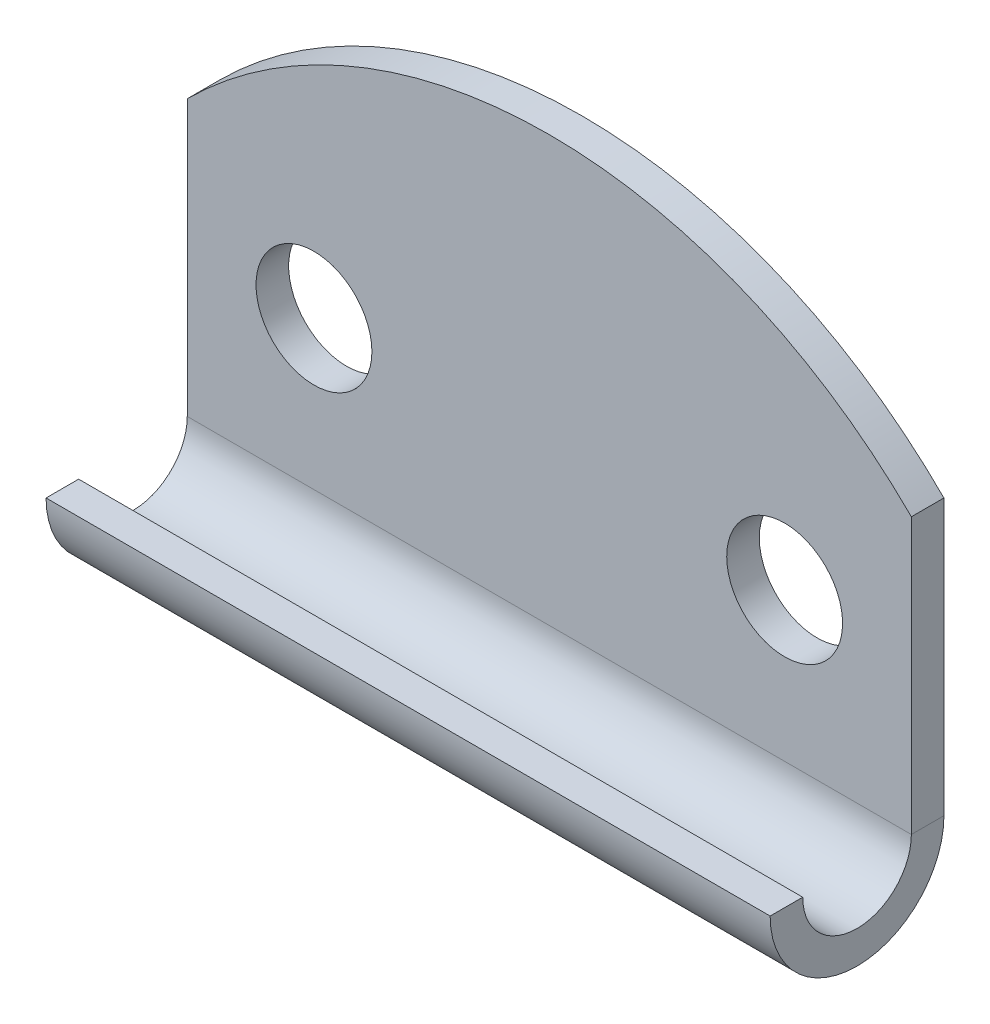
ISO-10303-21;
HEADER;
FILE_DESCRIPTION(('STEP AP214'),'2;1');
FILE_NAME('part.step','',(''),(''),'','','');
FILE_SCHEMA(('AUTOMOTIVE_DESIGN { 1 0 10303 214 1 1 1 1 }'));
ENDSEC;
DATA;
#1=APPLICATION_CONTEXT('core data for automotive mechanical design processes');
#2=APPLICATION_PROTOCOL_DEFINITION('international standard','automotive_design',2000,#1);
#3=PRODUCT_CONTEXT('',#1,'mechanical');
#4=PRODUCT('Part','Part','',(#3));
#5=PRODUCT_RELATED_PRODUCT_CATEGORY('part','',(#4));
#6=PRODUCT_DEFINITION_FORMATION('','',#4);
#7=PRODUCT_DEFINITION_CONTEXT('part definition',#1,'design');
#8=PRODUCT_DEFINITION('design','',#6,#7);
#9=PRODUCT_DEFINITION_SHAPE('','',#8);
#10=(LENGTH_UNIT() NAMED_UNIT(*) SI_UNIT(.MILLI.,.METRE.));
#11=(NAMED_UNIT(*) PLANE_ANGLE_UNIT() SI_UNIT($,.RADIAN.));
#12=(NAMED_UNIT(*) SI_UNIT($,.STERADIAN.) SOLID_ANGLE_UNIT());
#13=UNCERTAINTY_MEASURE_WITH_UNIT(LENGTH_MEASURE(1.E-05),#10,'distance_accuracy_value','');
#14=(GEOMETRIC_REPRESENTATION_CONTEXT(3) GLOBAL_UNCERTAINTY_ASSIGNED_CONTEXT((#13)) GLOBAL_UNIT_ASSIGNED_CONTEXT((#10,
#11,#12)) REPRESENTATION_CONTEXT('',''));
#15=CARTESIAN_POINT('',(0.,0.,0.));
#16=DIRECTION('',(0.,0.,1.));
#17=DIRECTION('',(1.,0.,0.));
#18=AXIS2_PLACEMENT_3D('',#15,#16,#17);
#19=CARTESIAN_POINT('',(10.,0.,-0.9));
#20=DIRECTION('',(1.,0.,0.));
#21=DIRECTION('',(0.,0.,-1.));
#22=AXIS2_PLACEMENT_3D('',#19,#20,#21);
#23=PLANE('',#22);
#24=DIRECTION('',(0.,1.,0.));
#25=VECTOR('',#24,1.);
#26=CARTESIAN_POINT('',(10.,0.,0.));
#27=LINE('',#26,#25);
#28=CARTESIAN_POINT('',(10.,2.4,0.));
#29=VERTEX_POINT('',#28);
#30=CARTESIAN_POINT('',(10.,10.,0.));
#31=VERTEX_POINT('',#30);
#32=EDGE_CURVE('E98',#29,#31,#27,.T.);
#33=ORIENTED_EDGE('',*,*,#32,.F.);
#34=DIRECTION('',(0.,0.,-1.));
#35=VECTOR('',#34,1.);
#36=CARTESIAN_POINT('',(10.,2.4,0.));
#37=LINE('',#36,#35);
#38=CARTESIAN_POINT('',(10.,2.39999999999999,-0.9));
#39=VERTEX_POINT('',#38);
#40=EDGE_CURVE('E133',#29,#39,#37,.T.);
#41=ORIENTED_EDGE('',*,*,#40,.T.);
#42=DIRECTION('',(0.,1.,0.));
#43=VECTOR('',#42,1.);
#44=CARTESIAN_POINT('',(10.,0.,-0.9));
#45=LINE('',#44,#43);
#46=CARTESIAN_POINT('',(10.,10.,-0.9));
#47=VERTEX_POINT('',#46);
#48=EDGE_CURVE('E109',#39,#47,#45,.T.);
#49=ORIENTED_EDGE('',*,*,#48,.T.);
#50=DIRECTION('',(0.,0.,1.));
#51=VECTOR('',#50,1.);
#52=CARTESIAN_POINT('',(10.,10.,-0.9));
#53=LINE('',#52,#51);
#54=EDGE_CURVE('E51',#47,#31,#53,.T.);
#55=ORIENTED_EDGE('',*,*,#54,.T.);
#56=EDGE_LOOP('',(#33,#41,#49,#55));
#57=FACE_BOUND('',#56,.T.);
#58=ADVANCED_FACE('F47',(#57),#23,.T.);
#59=CARTESIAN_POINT('',(-10.,0.,-0.9));
#60=DIRECTION('',(-1.,0.,0.));
#61=DIRECTION('',(0.,0.,1.));
#62=AXIS2_PLACEMENT_3D('',#59,#60,#61);
#63=PLANE('',#62);
#64=DIRECTION('',(0.,0.,-1.));
#65=VECTOR('',#64,1.);
#66=CARTESIAN_POINT('',(-10.,2.4,0.));
#67=LINE('',#66,#65);
#68=CARTESIAN_POINT('',(-10.,2.4,0.));
#69=VERTEX_POINT('',#68);
#70=CARTESIAN_POINT('',(-10.,2.39999999999999,-0.9));
#71=VERTEX_POINT('',#70);
#72=EDGE_CURVE('E94',#69,#71,#67,.T.);
#73=ORIENTED_EDGE('',*,*,#72,.F.);
#74=DIRECTION('',(0.,-1.,0.));
#75=VECTOR('',#74,1.);
#76=CARTESIAN_POINT('',(-10.,0.,0.));
#77=LINE('',#76,#75);
#78=CARTESIAN_POINT('',(-10.,10.,0.));
#79=VERTEX_POINT('',#78);
#80=EDGE_CURVE('E91',#79,#69,#77,.T.);
#81=ORIENTED_EDGE('',*,*,#80,.F.);
#82=DIRECTION('',(0.,0.,1.));
#83=VECTOR('',#82,1.);
#84=CARTESIAN_POINT('',(-10.,10.,-0.9));
#85=LINE('',#84,#83);
#86=CARTESIAN_POINT('',(-10.,10.,-0.9));
#87=VERTEX_POINT('',#86);
#88=EDGE_CURVE('E11',#87,#79,#85,.T.);
#89=ORIENTED_EDGE('',*,*,#88,.F.);
#90=DIRECTION('',(0.,-1.,0.));
#91=VECTOR('',#90,1.);
#92=CARTESIAN_POINT('',(-10.,0.,-0.9));
#93=LINE('',#92,#91);
#94=EDGE_CURVE('E105',#87,#71,#93,.T.);
#95=ORIENTED_EDGE('',*,*,#94,.T.);
#96=EDGE_LOOP('',(#73,#81,#89,#95));
#97=FACE_BOUND('',#96,.T.);
#98=ADVANCED_FACE('F49',(#97),#63,.T.);
#99=CARTESIAN_POINT('',(0.,0.,-0.9));
#100=DIRECTION('',(0.,0.,1.));
#101=DIRECTION('',(1.,0.,0.));
#102=AXIS2_PLACEMENT_3D('',#99,#100,#101);
#103=CYLINDRICAL_SURFACE('',#102,14.142135623731);
#104=CARTESIAN_POINT('',(0.,0.,0.));
#105=DIRECTION('',(0.,0.,1.));
#106=DIRECTION('',(-1.,0.,0.));
#107=AXIS2_PLACEMENT_3D('',#104,#105,#106);
#108=CIRCLE('',#107,14.142135623731);
#109=EDGE_CURVE('E86',#31,#79,#108,.T.);
#110=ORIENTED_EDGE('',*,*,#109,.F.);
#111=ORIENTED_EDGE('',*,*,#54,.F.);
#112=CARTESIAN_POINT('',(0.,0.,-0.9));
#113=DIRECTION('',(0.,0.,1.));
#114=DIRECTION('',(-1.,0.,0.));
#115=AXIS2_PLACEMENT_3D('',#112,#113,#114);
#116=CIRCLE('',#115,14.142135623731);
#117=EDGE_CURVE('E88',#47,#87,#116,.T.);
#118=ORIENTED_EDGE('',*,*,#117,.T.);
#119=ORIENTED_EDGE('',*,*,#88,.T.);
#120=EDGE_LOOP('',(#110,#111,#118,#119));
#121=FACE_BOUND('',#120,.T.);
#122=ADVANCED_FACE('F83',(#121),#103,.T.);
#123=CARTESIAN_POINT('',(0.,0.,-0.9));
#124=DIRECTION('',(0.,0.,-1.));
#125=DIRECTION('',(-1.,0.,0.));
#126=AXIS2_PLACEMENT_3D('',#123,#124,#125);
#127=PLANE('',#126);
#128=DIRECTION('',(1.,0.,0.));
#129=VECTOR('',#128,1.);
#130=CARTESIAN_POINT('',(10.,2.39999999999999,-0.9));
#131=LINE('',#130,#129);
#132=EDGE_CURVE('E164',#39,#71,#131,.F.);
#133=ORIENTED_EDGE('',*,*,#132,.T.);
#134=ORIENTED_EDGE('',*,*,#94,.F.);
#135=ORIENTED_EDGE('',*,*,#117,.F.);
#136=ORIENTED_EDGE('',*,*,#48,.F.);
#137=EDGE_LOOP('',(#133,#134,#135,#136));
#138=FACE_BOUND('',#137,.T.);
#139=CARTESIAN_POINT('',(6.5,6.49999999999999,-0.9));
#140=DIRECTION('',(0.,0.,1.));
#141=DIRECTION('',(-1.,0.,0.));
#142=AXIS2_PLACEMENT_3D('',#139,#140,#141);
#143=CIRCLE('',#142,1.6);
#144=CARTESIAN_POINT('',(4.9,6.49999999999999,-0.9));
#145=VERTEX_POINT('',#144);
#146=EDGE_CURVE('E121',#145,#145,#143,.T.);
#147=ORIENTED_EDGE('',*,*,#146,.T.);
#148=EDGE_LOOP('',(#147));
#149=FACE_BOUND('',#148,.T.);
#150=CARTESIAN_POINT('',(-6.5,6.5,-0.9));
#151=DIRECTION('',(0.,0.,1.));
#152=DIRECTION('',(1.,0.,0.));
#153=AXIS2_PLACEMENT_3D('',#150,#151,#152);
#154=CIRCLE('',#153,1.6);
#155=CARTESIAN_POINT('',(-4.9,6.5,-0.9));
#156=VERTEX_POINT('',#155);
#157=EDGE_CURVE('E99',#156,#156,#154,.T.);
#158=ORIENTED_EDGE('',*,*,#157,.T.);
#159=EDGE_LOOP('',(#158));
#160=FACE_BOUND('',#159,.T.);
#161=ADVANCED_FACE('F176',(#138,#149,#160),#127,.T.);
#162=CARTESIAN_POINT('',(0.,0.,0.));
#163=DIRECTION('',(0.,0.,-1.));
#164=DIRECTION('',(-1.,0.,0.));
#165=AXIS2_PLACEMENT_3D('',#162,#163,#164);
#166=PLANE('',#165);
#167=CARTESIAN_POINT('',(6.5,6.49999999999999,0.));
#168=DIRECTION('',(0.,0.,1.));
#169=DIRECTION('',(-1.,0.,0.));
#170=AXIS2_PLACEMENT_3D('',#167,#168,#169);
#171=CIRCLE('',#170,1.6);
#172=CARTESIAN_POINT('',(4.9,6.49999999999999,0.));
#173=VERTEX_POINT('',#172);
#174=EDGE_CURVE('E125',#173,#173,#171,.T.);
#175=ORIENTED_EDGE('',*,*,#174,.F.);
#176=EDGE_LOOP('',(#175));
#177=FACE_BOUND('',#176,.T.);
#178=CARTESIAN_POINT('',(-6.5,6.5,0.));
#179=DIRECTION('',(0.,0.,1.));
#180=DIRECTION('',(1.,0.,0.));
#181=AXIS2_PLACEMENT_3D('',#178,#179,#180);
#182=CIRCLE('',#181,1.6);
#183=CARTESIAN_POINT('',(-4.9,6.5,0.));
#184=VERTEX_POINT('',#183);
#185=EDGE_CURVE('E117',#184,#184,#182,.T.);
#186=ORIENTED_EDGE('',*,*,#185,.F.);
#187=EDGE_LOOP('',(#186));
#188=FACE_BOUND('',#187,.T.);
#189=ORIENTED_EDGE('',*,*,#80,.T.);
#190=DIRECTION('',(1.,0.,0.));
#191=VECTOR('',#190,1.);
#192=CARTESIAN_POINT('',(10.,2.4,0.));
#193=LINE('',#192,#191);
#194=EDGE_CURVE('E152',#29,#69,#193,.F.);
#195=ORIENTED_EDGE('',*,*,#194,.F.);
#196=ORIENTED_EDGE('',*,*,#32,.T.);
#197=ORIENTED_EDGE('',*,*,#109,.T.);
#198=EDGE_LOOP('',(#189,#195,#196,#197));
#199=FACE_BOUND('',#198,.T.);
#200=ADVANCED_FACE('F101',(#177,#188,#199),#166,.F.);
#201=CARTESIAN_POINT('',(-6.5,6.5,-0.9));
#202=DIRECTION('',(0.,0.,1.));
#203=DIRECTION('',(1.,0.,0.));
#204=AXIS2_PLACEMENT_3D('',#201,#202,#203);
#205=CYLINDRICAL_SURFACE('',#204,1.6);
#206=ORIENTED_EDGE('',*,*,#157,.F.);
#207=EDGE_LOOP('',(#206));
#208=FACE_BOUND('',#207,.T.);
#209=ORIENTED_EDGE('',*,*,#185,.T.);
#210=EDGE_LOOP('',(#209));
#211=FACE_BOUND('',#210,.T.);
#212=ADVANCED_FACE('F201',(#208,#211),#205,.F.);
#213=CARTESIAN_POINT('',(6.5,6.49999999999999,-0.9));
#214=DIRECTION('',(0.,0.,1.));
#215=DIRECTION('',(1.,0.,0.));
#216=AXIS2_PLACEMENT_3D('',#213,#214,#215);
#217=CYLINDRICAL_SURFACE('',#216,1.6);
#218=ORIENTED_EDGE('',*,*,#146,.F.);
#219=EDGE_LOOP('',(#218));
#220=FACE_BOUND('',#219,.T.);
#221=ORIENTED_EDGE('',*,*,#174,.T.);
#222=EDGE_LOOP('',(#221));
#223=FACE_BOUND('',#222,.T.);
#224=ADVANCED_FACE('F207',(#220,#223),#217,.F.);
#225=CARTESIAN_POINT('',(0.,2.40000000000001,3.));
#226=DIRECTION('',(0.,-1.,0.));
#227=DIRECTION('',(1.,0.,0.));
#228=AXIS2_PLACEMENT_3D('',#225,#226,#227);
#229=PLANE('',#228);
#230=DIRECTION('',(0.,0.,1.));
#231=VECTOR('',#230,1.);
#232=CARTESIAN_POINT('',(10.,2.40000000000001,3.));
#233=LINE('',#232,#231);
#234=CARTESIAN_POINT('',(10.,2.40000000000001,3.));
#235=VERTEX_POINT('',#234);
#236=CARTESIAN_POINT('',(10.,2.40000000000002,3.9));
#237=VERTEX_POINT('',#236);
#238=EDGE_CURVE('E129',#235,#237,#233,.T.);
#239=ORIENTED_EDGE('',*,*,#238,.F.);
#240=DIRECTION('',(1.,0.,0.));
#241=VECTOR('',#240,1.);
#242=CARTESIAN_POINT('',(10.,2.40000000000001,3.));
#243=LINE('',#242,#241);
#244=CARTESIAN_POINT('',(-10.,2.40000000000001,3.));
#245=VERTEX_POINT('',#244);
#246=EDGE_CURVE('E147',#245,#235,#243,.T.);
#247=ORIENTED_EDGE('',*,*,#246,.F.);
#248=DIRECTION('',(0.,0.,1.));
#249=VECTOR('',#248,1.);
#250=CARTESIAN_POINT('',(-10.,2.40000000000001,3.));
#251=LINE('',#250,#249);
#252=CARTESIAN_POINT('',(-10.,2.40000000000002,3.9));
#253=VERTEX_POINT('',#252);
#254=EDGE_CURVE('E141',#245,#253,#251,.T.);
#255=ORIENTED_EDGE('',*,*,#254,.T.);
#256=DIRECTION('',(1.,0.,0.));
#257=VECTOR('',#256,1.);
#258=CARTESIAN_POINT('',(10.,2.40000000000002,3.9));
#259=LINE('',#258,#257);
#260=EDGE_CURVE('E159',#253,#237,#259,.T.);
#261=ORIENTED_EDGE('',*,*,#260,.T.);
#262=EDGE_LOOP('',(#239,#247,#255,#261));
#263=FACE_BOUND('',#262,.T.);
#264=ADVANCED_FACE('F211',(#263),#229,.F.);
#265=CARTESIAN_POINT('',(-10.,2.4,1.5));
#266=DIRECTION('',(-1.,0.,0.));
#267=DIRECTION('',(0.,0.,1.));
#268=AXIS2_PLACEMENT_3D('',#265,#266,#267);
#269=PLANE('',#268);
#270=ORIENTED_EDGE('',*,*,#254,.F.);
#271=CARTESIAN_POINT('',(-10.,2.4,1.5));
#272=DIRECTION('',(1.,0.,0.));
#273=DIRECTION('',(0.,0.,-1.));
#274=AXIS2_PLACEMENT_3D('',#271,#272,#273);
#275=CIRCLE('',#274,1.5);
#276=EDGE_CURVE('E155',#69,#245,#275,.F.);
#277=ORIENTED_EDGE('',*,*,#276,.F.);
#278=ORIENTED_EDGE('',*,*,#72,.T.);
#279=CARTESIAN_POINT('',(-10.,2.4,1.5));
#280=DIRECTION('',(1.,0.,0.));
#281=DIRECTION('',(0.,0.,-1.));
#282=AXIS2_PLACEMENT_3D('',#279,#280,#281);
#283=CIRCLE('',#282,2.4);
#284=EDGE_CURVE('E137',#71,#253,#283,.F.);
#285=ORIENTED_EDGE('',*,*,#284,.T.);
#286=EDGE_LOOP('',(#270,#277,#278,#285));
#287=FACE_BOUND('',#286,.T.);
#288=ADVANCED_FACE('F215',(#287),#269,.T.);
#289=CARTESIAN_POINT('',(10.,2.4,1.5));
#290=DIRECTION('',(-1.,0.,0.));
#291=DIRECTION('',(0.,0.,1.));
#292=AXIS2_PLACEMENT_3D('',#289,#290,#291);
#293=PLANE('',#292);
#294=CARTESIAN_POINT('',(10.,2.4,1.5));
#295=DIRECTION('',(1.,0.,0.));
#296=DIRECTION('',(0.,0.,-1.));
#297=AXIS2_PLACEMENT_3D('',#294,#295,#296);
#298=CIRCLE('',#297,1.5);
#299=EDGE_CURVE('E63',#235,#29,#298,.T.);
#300=ORIENTED_EDGE('',*,*,#299,.F.);
#301=ORIENTED_EDGE('',*,*,#238,.T.);
#302=CARTESIAN_POINT('',(10.,2.4,1.5));
#303=DIRECTION('',(1.,0.,0.));
#304=DIRECTION('',(0.,0.,-1.));
#305=AXIS2_PLACEMENT_3D('',#302,#303,#304);
#306=CIRCLE('',#305,2.4);
#307=EDGE_CURVE('E160',#237,#39,#306,.T.);
#308=ORIENTED_EDGE('',*,*,#307,.T.);
#309=ORIENTED_EDGE('',*,*,#40,.F.);
#310=EDGE_LOOP('',(#300,#301,#308,#309));
#311=FACE_BOUND('',#310,.T.);
#312=ADVANCED_FACE('F188',(#311),#293,.F.);
#313=CARTESIAN_POINT('',(10.,2.4,1.5));
#314=DIRECTION('',(1.,0.,0.));
#315=DIRECTION('',(0.,0.,1.));
#316=AXIS2_PLACEMENT_3D('',#313,#314,#315);
#317=CYLINDRICAL_SURFACE('',#316,2.4);
#318=ORIENTED_EDGE('',*,*,#132,.F.);
#319=ORIENTED_EDGE('',*,*,#307,.F.);
#320=ORIENTED_EDGE('',*,*,#260,.F.);
#321=ORIENTED_EDGE('',*,*,#284,.F.);
#322=EDGE_LOOP('',(#318,#319,#320,#321));
#323=FACE_BOUND('',#322,.T.);
#324=ADVANCED_FACE('F183',(#323),#317,.T.);
#325=CARTESIAN_POINT('',(10.,2.4,1.5));
#326=DIRECTION('',(1.,0.,0.));
#327=DIRECTION('',(0.,0.,1.));
#328=AXIS2_PLACEMENT_3D('',#325,#326,#327);
#329=CYLINDRICAL_SURFACE('',#328,1.5);
#330=ORIENTED_EDGE('',*,*,#194,.T.);
#331=ORIENTED_EDGE('',*,*,#276,.T.);
#332=ORIENTED_EDGE('',*,*,#246,.T.);
#333=ORIENTED_EDGE('',*,*,#299,.T.);
#334=EDGE_LOOP('',(#330,#331,#332,#333));
#335=FACE_BOUND('',#334,.T.);
#336=ADVANCED_FACE('F222',(#335),#329,.F.);
#337=CLOSED_SHELL('',(#58,#98,#122,#161,#200,#212,#224,#264,#288,#312,#324,#336));
#338=MANIFOLD_SOLID_BREP('B2',#337);
#339=ADVANCED_BREP_SHAPE_REPRESENTATION('',(#18,#338),#14);
#340=SHAPE_DEFINITION_REPRESENTATION(#9,#339);
ENDSEC;
END-ISO-10303-21;
